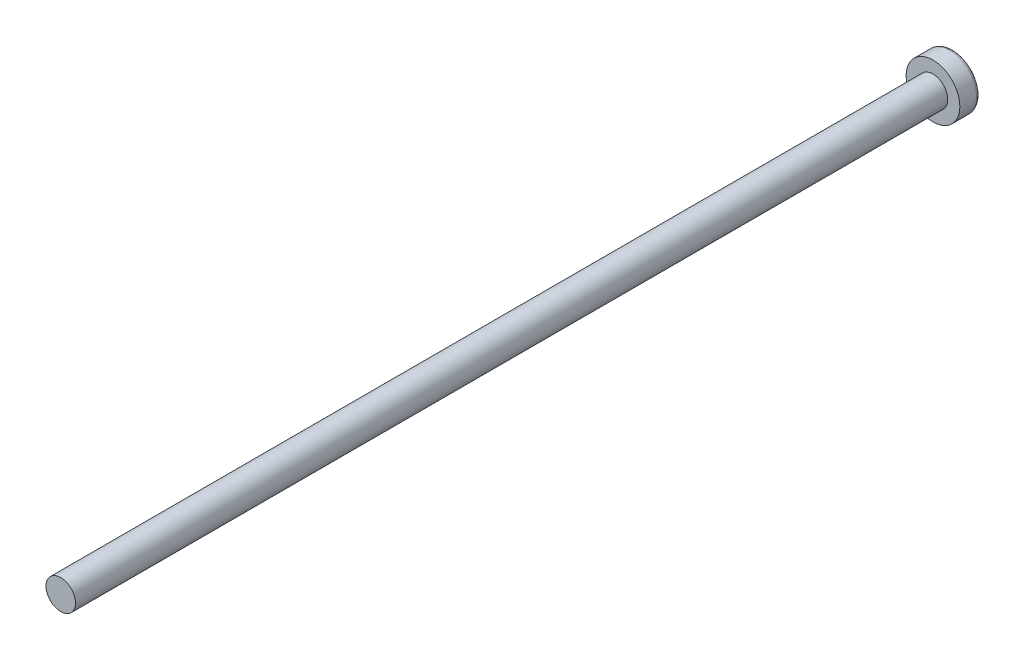
ISO-10303-21;
HEADER;
FILE_DESCRIPTION(('STEP AP214'),'2;1');
FILE_NAME('part.step','',(''),(''),'','','');
FILE_SCHEMA(('AUTOMOTIVE_DESIGN { 1 0 10303 214 1 1 1 1 }'));
ENDSEC;
DATA;
#1=APPLICATION_CONTEXT('core data for automotive mechanical design processes');
#2=APPLICATION_PROTOCOL_DEFINITION('international standard','automotive_design',2000,#1);
#3=PRODUCT_CONTEXT('',#1,'mechanical');
#4=PRODUCT('Part','Part','',(#3));
#5=PRODUCT_RELATED_PRODUCT_CATEGORY('part','',(#4));
#6=PRODUCT_DEFINITION_FORMATION('','',#4);
#7=PRODUCT_DEFINITION_CONTEXT('part definition',#1,'design');
#8=PRODUCT_DEFINITION('design','',#6,#7);
#9=PRODUCT_DEFINITION_SHAPE('','',#8);
#10=(LENGTH_UNIT() NAMED_UNIT(*) SI_UNIT(.MILLI.,.METRE.));
#11=(NAMED_UNIT(*) PLANE_ANGLE_UNIT() SI_UNIT($,.RADIAN.));
#12=(NAMED_UNIT(*) SI_UNIT($,.STERADIAN.) SOLID_ANGLE_UNIT());
#13=UNCERTAINTY_MEASURE_WITH_UNIT(LENGTH_MEASURE(1.E-05),#10,'distance_accuracy_value','');
#14=(GEOMETRIC_REPRESENTATION_CONTEXT(3) GLOBAL_UNCERTAINTY_ASSIGNED_CONTEXT((#13)) GLOBAL_UNIT_ASSIGNED_CONTEXT((#10,
#11,#12)) REPRESENTATION_CONTEXT('',''));
#15=CARTESIAN_POINT('',(0.,0.,0.));
#16=DIRECTION('',(0.,0.,1.));
#17=DIRECTION('',(1.,0.,0.));
#18=AXIS2_PLACEMENT_3D('',#15,#16,#17);
#19=CARTESIAN_POINT('',(46.295947098363,46.3176902596998,78.7922710574948));
#20=DIRECTION('',(0.,0.,1.));
#21=DIRECTION('',(0.,-1.,0.));
#22=AXIS2_PLACEMENT_3D('',#19,#20,#21);
#23=CYLINDRICAL_SURFACE('',#22,4.);
#24=CARTESIAN_POINT('',(46.295947098363,46.3176902596998,79.2922710574948));
#25=DIRECTION('',(0.,0.,1.));
#26=DIRECTION('',(1.,0.,0.));
#27=AXIS2_PLACEMENT_3D('',#24,#25,#26);
#28=CIRCLE('',#27,4.);
#29=CARTESIAN_POINT('',(50.295947098363,46.3176902596998,79.2922710574948));
#30=VERTEX_POINT('',#29);
#31=EDGE_CURVE('E11',#30,#30,#28,.T.);
#32=ORIENTED_EDGE('',*,*,#31,.T.);
#33=EDGE_LOOP('',(#32));
#34=FACE_BOUND('',#33,.T.);
#35=CARTESIAN_POINT('',(46.295947098363,46.3176902596998,81.7922710574948));
#36=DIRECTION('',(0.,0.,-1.));
#37=DIRECTION('',(-0.707106781186547,-0.707106781186548,0.));
#38=AXIS2_PLACEMENT_3D('',#35,#36,#37);
#39=CIRCLE('',#38,4.);
#40=CARTESIAN_POINT('',(43.4675199736168,43.4892631349535,81.7922710574948));
#41=VERTEX_POINT('',#40);
#42=EDGE_CURVE('E27',#41,#41,#39,.T.);
#43=ORIENTED_EDGE('',*,*,#42,.T.);
#44=EDGE_LOOP('',(#43));
#45=FACE_BOUND('',#44,.T.);
#46=ADVANCED_FACE('F17',(#34,#45),#23,.T.);
#47=CARTESIAN_POINT('',(46.295947098363,46.3176902596998,78.7922710574948));
#48=DIRECTION('',(0.,0.,-1.));
#49=DIRECTION('',(1.,0.,0.));
#50=AXIS2_PLACEMENT_3D('',#47,#48,#49);
#51=PLANE('',#50);
#52=CARTESIAN_POINT('',(46.295947098363,46.3176902596998,78.7922710574948));
#53=DIRECTION('',(0.,0.,-1.));
#54=DIRECTION('',(1.,0.,0.));
#55=AXIS2_PLACEMENT_3D('',#52,#53,#54);
#56=CIRCLE('',#55,3.5);
#57=CARTESIAN_POINT('',(49.795947098363,46.3176902596998,78.7922710574948));
#58=VERTEX_POINT('',#57);
#59=EDGE_CURVE('E47',#58,#58,#56,.T.);
#60=ORIENTED_EDGE('',*,*,#59,.T.);
#61=EDGE_LOOP('',(#60));
#62=FACE_BOUND('',#61,.T.);
#63=ADVANCED_FACE('F58',(#62),#51,.T.);
#64=CARTESIAN_POINT('',(46.295947098363,46.3176902596998,81.7922710574948));
#65=DIRECTION('',(0.,0.,-1.));
#66=DIRECTION('',(1.,0.,0.));
#67=AXIS2_PLACEMENT_3D('',#64,#65,#66);
#68=PLANE('',#67);
#69=CARTESIAN_POINT('',(46.295947098363,46.3176902596997,81.7922710574948));
#70=DIRECTION('',(0.,0.,-1.));
#71=DIRECTION('',(-0.707106781186548,-0.707106781186548,0.));
#72=AXIS2_PLACEMENT_3D('',#69,#70,#71);
#73=CIRCLE('',#72,2.2);
#74=CARTESIAN_POINT('',(44.7403121797526,44.7620553410893,81.7922710574948));
#75=VERTEX_POINT('',#74);
#76=EDGE_CURVE('E42',#75,#75,#73,.T.);
#77=ORIENTED_EDGE('',*,*,#76,.T.);
#78=EDGE_LOOP('',(#77));
#79=FACE_BOUND('',#78,.T.);
#80=ORIENTED_EDGE('',*,*,#42,.F.);
#81=EDGE_LOOP('',(#80));
#82=FACE_BOUND('',#81,.T.);
#83=ADVANCED_FACE('F55',(#79,#82),#68,.F.);
#84=CARTESIAN_POINT('',(46.295947098363,46.3176902596998,79.2922710574948));
#85=DIRECTION('',(0.,0.,-1.));
#86=DIRECTION('',(1.,0.,0.));
#87=AXIS2_PLACEMENT_3D('',#84,#85,#86);
#88=TOROIDAL_SURFACE('',#87,3.5,0.5);
#89=ORIENTED_EDGE('',*,*,#31,.F.);
#90=EDGE_LOOP('',(#89));
#91=FACE_BOUND('',#90,.T.);
#92=ORIENTED_EDGE('',*,*,#59,.F.);
#93=EDGE_LOOP('',(#92));
#94=FACE_BOUND('',#93,.T.);
#95=ADVANCED_FACE('F57',(#91,#94),#88,.T.);
#96=CARTESIAN_POINT('',(46.2959470983624,46.3176902597002,211.792271057495));
#97=DIRECTION('',(0.,0.,-1.));
#98=DIRECTION('',(0.,1.,0.));
#99=AXIS2_PLACEMENT_3D('',#96,#97,#98);
#100=CYLINDRICAL_SURFACE('',#99,2.2);
#101=CARTESIAN_POINT('',(46.2959470983624,46.3176902597002,211.792271057495));
#102=DIRECTION('',(0.,0.,-1.));
#103=DIRECTION('',(-0.707106781186548,-0.707106781186548,0.));
#104=AXIS2_PLACEMENT_3D('',#101,#102,#103);
#105=CIRCLE('',#104,2.2);
#106=CARTESIAN_POINT('',(44.7403121797521,44.7620553410897,211.792271057495));
#107=VERTEX_POINT('',#106);
#108=EDGE_CURVE('E21',#107,#107,#105,.T.);
#109=ORIENTED_EDGE('',*,*,#108,.T.);
#110=EDGE_LOOP('',(#109));
#111=FACE_BOUND('',#110,.T.);
#112=ORIENTED_EDGE('',*,*,#76,.F.);
#113=EDGE_LOOP('',(#112));
#114=FACE_BOUND('',#113,.T.);
#115=ADVANCED_FACE('F65',(#111,#114),#100,.T.);
#116=CARTESIAN_POINT('',(46.2959470983624,46.3176902597002,211.792271057495));
#117=DIRECTION('',(0.,0.,-1.));
#118=DIRECTION('',(1.,0.,0.));
#119=AXIS2_PLACEMENT_3D('',#116,#117,#118);
#120=PLANE('',#119);
#121=ORIENTED_EDGE('',*,*,#108,.F.);
#122=EDGE_LOOP('',(#121));
#123=FACE_BOUND('',#122,.T.);
#124=ADVANCED_FACE('F19',(#123),#120,.F.);
#125=CLOSED_SHELL('',(#46,#63,#83,#95,#115,#124));
#126=MANIFOLD_SOLID_BREP('B1',#125);
#127=ADVANCED_BREP_SHAPE_REPRESENTATION('',(#18,#126),#14);
#128=SHAPE_DEFINITION_REPRESENTATION(#9,#127);
ENDSEC;
END-ISO-10303-21;
